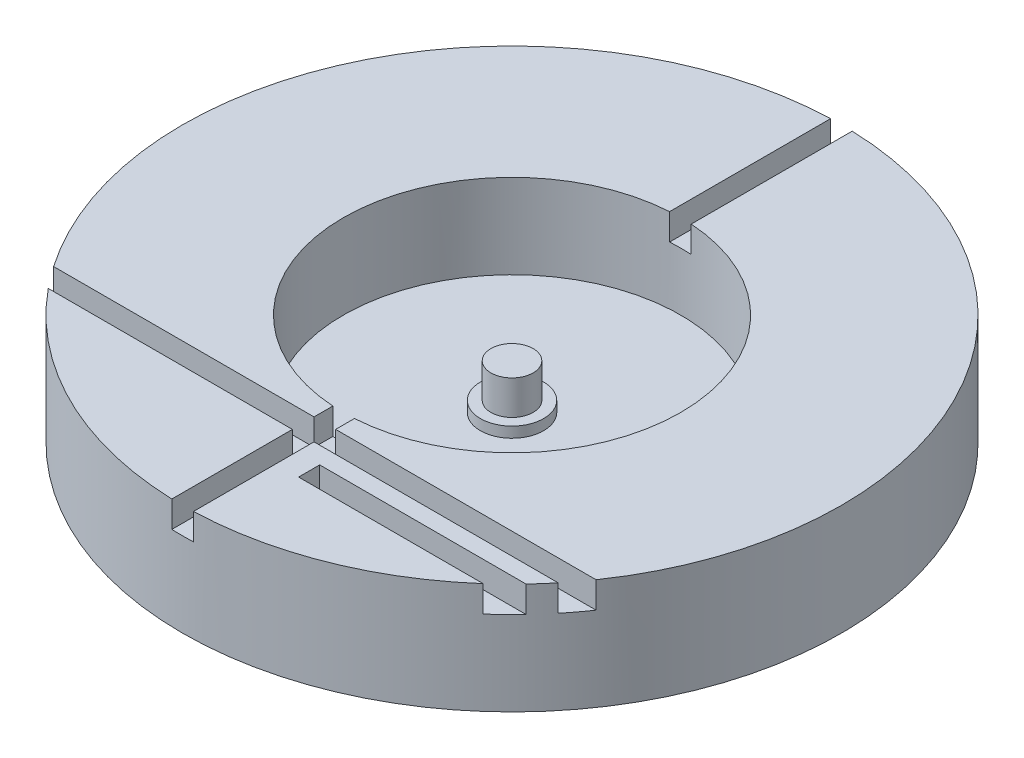
ISO-10303-21;
HEADER;
FILE_DESCRIPTION(('STEP AP214'),'2;1');
FILE_NAME('part.step','',(''),(''),'','','');
FILE_SCHEMA(('AUTOMOTIVE_DESIGN { 1 0 10303 214 1 1 1 1 }'));
ENDSEC;
DATA;
#1=APPLICATION_CONTEXT('core data for automotive mechanical design processes');
#2=APPLICATION_PROTOCOL_DEFINITION('international standard','automotive_design',2000,#1);
#3=PRODUCT_CONTEXT('',#1,'mechanical');
#4=PRODUCT('Part','Part','',(#3));
#5=PRODUCT_RELATED_PRODUCT_CATEGORY('part','',(#4));
#6=PRODUCT_DEFINITION_FORMATION('','',#4);
#7=PRODUCT_DEFINITION_CONTEXT('part definition',#1,'design');
#8=PRODUCT_DEFINITION('design','',#6,#7);
#9=PRODUCT_DEFINITION_SHAPE('','',#8);
#10=(LENGTH_UNIT() NAMED_UNIT(*) SI_UNIT(.MILLI.,.METRE.));
#11=(NAMED_UNIT(*) PLANE_ANGLE_UNIT() SI_UNIT($,.RADIAN.));
#12=(NAMED_UNIT(*) SI_UNIT($,.STERADIAN.) SOLID_ANGLE_UNIT());
#13=UNCERTAINTY_MEASURE_WITH_UNIT(LENGTH_MEASURE(1.E-05),#10,'distance_accuracy_value','');
#14=(GEOMETRIC_REPRESENTATION_CONTEXT(3) GLOBAL_UNCERTAINTY_ASSIGNED_CONTEXT((#13)) GLOBAL_UNIT_ASSIGNED_CONTEXT((#10,
#11,#12)) REPRESENTATION_CONTEXT('',''));
#15=CARTESIAN_POINT('',(0.,0.,0.));
#16=DIRECTION('',(0.,0.,1.));
#17=DIRECTION('',(1.,0.,0.));
#18=AXIS2_PLACEMENT_3D('',#15,#16,#17);
#19=CARTESIAN_POINT('',(0.,21.,0.));
#20=DIRECTION('',(0.,1.,0.));
#21=DIRECTION('',(0.,0.,1.));
#22=AXIS2_PLACEMENT_3D('',#19,#20,#21);
#23=PLANE('',#22);
#24=DIRECTION('',(1.,0.,0.));
#25=VECTOR('',#24,1.);
#26=CARTESIAN_POINT('',(0.,21.,46.8482798010705));
#27=LINE('',#26,#25);
#28=CARTESIAN_POINT('',(6.37014236959566,21.,46.8482798010705));
#29=VERTEX_POINT('',#28);
#30=CARTESIAN_POINT('',(41.3701423695956,21.,46.8482798010705));
#31=VERTEX_POINT('',#30);
#32=EDGE_CURVE('E387',#29,#31,#27,.T.);
#33=ORIENTED_EDGE('',*,*,#32,.F.);
#34=DIRECTION('',(0.,0.,1.));
#35=VECTOR('',#34,1.);
#36=CARTESIAN_POINT('',(6.37014236959566,21.,0.));
#37=LINE('',#36,#35);
#38=CARTESIAN_POINT('',(6.37014236959566,21.,42.8482798010705));
#39=VERTEX_POINT('',#38);
#40=EDGE_CURVE('E384',#39,#29,#37,.T.);
#41=ORIENTED_EDGE('',*,*,#40,.F.);
#42=DIRECTION('',(1.,0.,0.));
#43=VECTOR('',#42,1.);
#44=CARTESIAN_POINT('',(0.,21.,42.8482798010705));
#45=LINE('',#44,#43);
#46=CARTESIAN_POINT('',(45.5002738243318,21.,42.8482798010705));
#47=VERTEX_POINT('',#46);
#48=EDGE_CURVE('E373',#39,#47,#45,.T.);
#49=ORIENTED_EDGE('',*,*,#48,.T.);
#50=CARTESIAN_POINT('',(0.,21.,0.));
#51=DIRECTION('',(0.,1.,0.));
#52=DIRECTION('',(0.,0.,1.));
#53=AXIS2_PLACEMENT_3D('',#50,#51,#52);
#54=CIRCLE('',#53,62.5);
#55=CARTESIAN_POINT('',(48.35,21.,39.6046398796909));
#56=VERTEX_POINT('',#55);
#57=EDGE_CURVE('E189',#47,#56,#54,.T.);
#58=ORIENTED_EDGE('',*,*,#57,.T.);
#59=DIRECTION('',(1.,0.,0.));
#60=VECTOR('',#59,1.);
#61=CARTESIAN_POINT('',(-48.35,21.,39.6046398796909));
#62=LINE('',#61,#60);
#63=CARTESIAN_POINT('',(2.05000000000001,21.,39.6046398796909));
#64=VERTEX_POINT('',#63);
#65=EDGE_CURVE('E211',#64,#56,#62,.T.);
#66=ORIENTED_EDGE('',*,*,#65,.F.);
#67=DIRECTION('',(0.,0.,-1.));
#68=VECTOR('',#67,1.);
#69=CARTESIAN_POINT('',(2.05000000000001,21.,-62.4663709526974));
#70=LINE('',#69,#68);
#71=CARTESIAN_POINT('',(2.05000000000001,21.,62.4663709526974));
#72=VERTEX_POINT('',#71);
#73=EDGE_CURVE('E233',#72,#64,#70,.T.);
#74=ORIENTED_EDGE('',*,*,#73,.F.);
#75=EDGE_CURVE('E281',#72,#31,#54,.T.);
#76=ORIENTED_EDGE('',*,*,#75,.T.);
#77=EDGE_LOOP('',(#33,#41,#49,#58,#66,#74,#76));
#78=FACE_BOUND('',#77,.T.);
#79=ADVANCED_FACE('F32',(#78),#23,.T.);
#80=CARTESIAN_POINT('',(-48.35,21.,39.6046398796908));
#81=VERTEX_POINT('',#80);
#82=CARTESIAN_POINT('',(-2.04999999999999,21.,39.6046398796909));
#83=VERTEX_POINT('',#82);
#84=EDGE_CURVE('E201',#81,#83,#62,.T.);
#85=ORIENTED_EDGE('',*,*,#84,.F.);
#86=CARTESIAN_POINT('',(-2.05000000000002,21.,62.4663709526974));
#87=VERTEX_POINT('',#86);
#88=EDGE_CURVE('E288',#81,#87,#54,.T.);
#89=ORIENTED_EDGE('',*,*,#88,.T.);
#90=DIRECTION('',(0.,0.,1.));
#91=VECTOR('',#90,1.);
#92=CARTESIAN_POINT('',(-2.04999999999999,21.,-62.4663709526974));
#93=LINE('',#92,#91);
#94=EDGE_CURVE('E228',#83,#87,#93,.T.);
#95=ORIENTED_EDGE('',*,*,#94,.F.);
#96=EDGE_LOOP('',(#85,#89,#95));
#97=FACE_BOUND('',#96,.T.);
#98=ADVANCED_FACE('F374',(#97),#23,.T.);
#99=CARTESIAN_POINT('',(-2.04999999999999,16.,-62.4663709526974));
#100=DIRECTION('',(-1.,0.,0.));
#101=DIRECTION('',(0.,0.,1.));
#102=AXIS2_PLACEMENT_3D('',#99,#100,#101);
#103=PLANE('',#102);
#104=DIRECTION('',(0.,0.,1.));
#105=VECTOR('',#104,1.);
#106=CARTESIAN_POINT('',(-2.04999999999999,16.,-62.4663709526974));
#107=LINE('',#106,#105);
#108=CARTESIAN_POINT('',(-2.04999999999999,16.,39.6046398796909));
#109=VERTEX_POINT('',#108);
#110=CARTESIAN_POINT('',(-2.05000000000002,16.,62.4663709526974));
#111=VERTEX_POINT('',#110);
#112=EDGE_CURVE('E232',#109,#111,#107,.T.);
#113=ORIENTED_EDGE('',*,*,#112,.F.);
#114=DIRECTION('',(0.,1.,0.));
#115=VECTOR('',#114,1.);
#116=CARTESIAN_POINT('',(-2.04999999999999,16.,39.6046398796909));
#117=LINE('',#116,#115);
#118=EDGE_CURVE('E225',#109,#83,#117,.T.);
#119=ORIENTED_EDGE('',*,*,#118,.T.);
#120=ORIENTED_EDGE('',*,*,#94,.T.);
#121=DIRECTION('',(0.,1.,0.));
#122=VECTOR('',#121,1.);
#123=CARTESIAN_POINT('',(-2.05000000000002,16.,62.4663709526974));
#124=LINE('',#123,#122);
#125=EDGE_CURVE('E258',#111,#87,#124,.T.);
#126=ORIENTED_EDGE('',*,*,#125,.F.);
#127=EDGE_LOOP('',(#113,#119,#120,#126));
#128=FACE_BOUND('',#127,.T.);
#129=ADVANCED_FACE('F353',(#128),#103,.F.);
#130=CARTESIAN_POINT('',(2.05000000000001,16.,-62.4663709526974));
#131=DIRECTION('',(1.,0.,0.));
#132=DIRECTION('',(0.,0.,-1.));
#133=AXIS2_PLACEMENT_3D('',#130,#131,#132);
#134=PLANE('',#133);
#135=ORIENTED_EDGE('',*,*,#73,.T.);
#136=DIRECTION('',(0.,-1.,0.));
#137=VECTOR('',#136,1.);
#138=CARTESIAN_POINT('',(2.05000000000001,16.,39.6046398796909));
#139=LINE('',#138,#137);
#140=CARTESIAN_POINT('',(2.05000000000001,16.,39.6046398796909));
#141=VERTEX_POINT('',#140);
#142=EDGE_CURVE('E11',#64,#141,#139,.T.);
#143=ORIENTED_EDGE('',*,*,#142,.T.);
#144=DIRECTION('',(0.,0.,-1.));
#145=VECTOR('',#144,1.);
#146=CARTESIAN_POINT('',(2.05000000000001,16.,-62.4663709526974));
#147=LINE('',#146,#145);
#148=CARTESIAN_POINT('',(2.05000000000001,16.,62.4663709526974));
#149=VERTEX_POINT('',#148);
#150=EDGE_CURVE('E240',#149,#141,#147,.T.);
#151=ORIENTED_EDGE('',*,*,#150,.F.);
#152=DIRECTION('',(0.,1.,0.));
#153=VECTOR('',#152,1.);
#154=CARTESIAN_POINT('',(2.05000000000001,16.,62.4663709526974));
#155=LINE('',#154,#153);
#156=EDGE_CURVE('E256',#149,#72,#155,.T.);
#157=ORIENTED_EDGE('',*,*,#156,.T.);
#158=EDGE_LOOP('',(#135,#143,#151,#157));
#159=FACE_BOUND('',#158,.T.);
#160=ADVANCED_FACE('F363',(#159),#134,.F.);
#161=DIRECTION('',(-1.,0.,0.));
#162=VECTOR('',#161,1.);
#163=CARTESIAN_POINT('',(-51.4392845984468,21.,35.5));
#164=LINE('',#163,#162);
#165=CARTESIAN_POINT('',(51.4392845984468,21.,35.5));
#166=VERTEX_POINT('',#165);
#167=CARTESIAN_POINT('',(2.05000000000001,21.,35.5));
#168=VERTEX_POINT('',#167);
#169=EDGE_CURVE('E209',#166,#168,#164,.T.);
#170=ORIENTED_EDGE('',*,*,#169,.F.);
#171=CARTESIAN_POINT('',(2.05000000000001,21.,-62.4663709526974));
#172=VERTEX_POINT('',#171);
#173=EDGE_CURVE('E323',#166,#172,#54,.T.);
#174=ORIENTED_EDGE('',*,*,#173,.T.);
#175=CARTESIAN_POINT('',(2.05000000000001,21.,-31.9342684275059));
#176=VERTEX_POINT('',#175);
#177=EDGE_CURVE('E247',#176,#172,#70,.T.);
#178=ORIENTED_EDGE('',*,*,#177,.F.);
#179=CARTESIAN_POINT('',(0.,21.,0.));
#180=DIRECTION('',(0.,1.,0.));
#181=DIRECTION('',(0.,0.,1.));
#182=AXIS2_PLACEMENT_3D('',#179,#180,#181);
#183=CIRCLE('',#182,32.);
#184=CARTESIAN_POINT('',(2.05000000000001,21.,31.9342684275059));
#185=VERTEX_POINT('',#184);
#186=EDGE_CURVE('E278',#185,#176,#183,.T.);
#187=ORIENTED_EDGE('',*,*,#186,.F.);
#188=EDGE_CURVE('E251',#168,#185,#70,.T.);
#189=ORIENTED_EDGE('',*,*,#188,.F.);
#190=EDGE_LOOP('',(#170,#174,#178,#187,#189));
#191=FACE_BOUND('',#190,.T.);
#192=ADVANCED_FACE('F313',(#191),#23,.T.);
#193=CARTESIAN_POINT('',(0.,7.,0.));
#194=DIRECTION('',(0.,1.,0.));
#195=DIRECTION('',(0.,0.,1.));
#196=AXIS2_PLACEMENT_3D('',#193,#194,#195);
#197=CYLINDRICAL_SURFACE('',#196,4.);
#198=CARTESIAN_POINT('',(0.,7.,0.));
#199=DIRECTION('',(0.,1.,0.));
#200=DIRECTION('',(0.,0.,1.));
#201=AXIS2_PLACEMENT_3D('',#198,#199,#200);
#202=CIRCLE('',#201,4.);
#203=CARTESIAN_POINT('',(0.,7.,4.));
#204=VERTEX_POINT('',#203);
#205=EDGE_CURVE('E264',#204,#204,#202,.T.);
#206=CARTESIAN_POINT('',(0.,13.5,0.));
#207=DIRECTION('',(0.,1.,0.));
#208=DIRECTION('',(0.,0.,1.));
#209=AXIS2_PLACEMENT_3D('',#206,#207,#208);
#210=CIRCLE('',#209,4.);
#211=CARTESIAN_POINT('',(0.,13.5,4.));
#212=VERTEX_POINT('',#211);
#213=EDGE_CURVE('E255',#212,#212,#210,.T.);
#214=CARTESIAN_POINT('',(0.,7.,4.));
#215=CARTESIAN_POINT('',(0.,7.06770833333334,4.));
#216=CARTESIAN_POINT('',(0.,7.13541666666667,4.));
#217=CARTESIAN_POINT('',(0.,7.27083333333334,4.));
#218=CARTESIAN_POINT('',(0.,7.33854166666667,4.));
#219=CARTESIAN_POINT('',(0.,7.47395833333334,4.));
#220=CARTESIAN_POINT('',(0.,7.54166666666667,4.));
#221=CARTESIAN_POINT('',(0.,7.67708333333333,4.));
#222=CARTESIAN_POINT('',(0.,7.74479166666667,4.));
#223=CARTESIAN_POINT('',(0.,7.88020833333333,4.));
#224=CARTESIAN_POINT('',(0.,7.94791666666667,4.));
#225=CARTESIAN_POINT('',(0.,8.08333333333333,4.));
#226=CARTESIAN_POINT('',(0.,8.15104166666667,4.));
#227=CARTESIAN_POINT('',(0.,8.28645833333334,4.));
#228=CARTESIAN_POINT('',(0.,8.35416666666667,4.));
#229=CARTESIAN_POINT('',(0.,8.48958333333334,4.));
#230=CARTESIAN_POINT('',(0.,8.55729166666667,4.));
#231=CARTESIAN_POINT('',(0.,8.69270833333334,4.));
#232=CARTESIAN_POINT('',(0.,8.76041666666667,4.));
#233=CARTESIAN_POINT('',(0.,8.89583333333334,4.));
#234=CARTESIAN_POINT('',(0.,8.96354166666667,4.));
#235=CARTESIAN_POINT('',(0.,9.09895833333333,4.));
#236=CARTESIAN_POINT('',(0.,9.16666666666667,4.));
#237=CARTESIAN_POINT('',(0.,9.30208333333333,4.));
#238=CARTESIAN_POINT('',(0.,9.36979166666667,4.));
#239=CARTESIAN_POINT('',(0.,9.50520833333333,4.));
#240=CARTESIAN_POINT('',(0.,9.57291666666667,4.));
#241=CARTESIAN_POINT('',(0.,9.70833333333333,4.));
#242=CARTESIAN_POINT('',(0.,9.77604166666667,4.));
#243=CARTESIAN_POINT('',(0.,9.91145833333333,4.));
#244=CARTESIAN_POINT('',(0.,9.97916666666667,4.));
#245=CARTESIAN_POINT('',(0.,10.1145833333333,4.));
#246=CARTESIAN_POINT('',(0.,10.1822916666667,4.));
#247=CARTESIAN_POINT('',(0.,10.3177083333333,4.));
#248=CARTESIAN_POINT('',(0.,10.3854166666667,4.));
#249=CARTESIAN_POINT('',(0.,10.5208333333333,4.));
#250=CARTESIAN_POINT('',(0.,10.5885416666667,4.));
#251=CARTESIAN_POINT('',(0.,10.7239583333333,4.));
#252=CARTESIAN_POINT('',(0.,10.7916666666667,4.));
#253=CARTESIAN_POINT('',(0.,10.9270833333333,4.));
#254=CARTESIAN_POINT('',(0.,10.9947916666667,4.));
#255=CARTESIAN_POINT('',(0.,11.1302083333333,4.));
#256=CARTESIAN_POINT('',(0.,11.1979166666667,4.));
#257=CARTESIAN_POINT('',(0.,11.3333333333333,4.));
#258=CARTESIAN_POINT('',(0.,11.4010416666667,4.));
#259=CARTESIAN_POINT('',(0.,11.5364583333333,4.));
#260=CARTESIAN_POINT('',(0.,11.6041666666667,4.));
#261=CARTESIAN_POINT('',(0.,11.7395833333333,4.));
#262=CARTESIAN_POINT('',(0.,11.8072916666667,4.));
#263=CARTESIAN_POINT('',(0.,11.9427083333333,4.));
#264=CARTESIAN_POINT('',(0.,12.0104166666667,4.));
#265=CARTESIAN_POINT('',(0.,12.1458333333333,4.));
#266=CARTESIAN_POINT('',(0.,12.2135416666667,4.));
#267=CARTESIAN_POINT('',(0.,12.3489583333333,4.));
#268=CARTESIAN_POINT('',(0.,12.4166666666667,4.));
#269=CARTESIAN_POINT('',(0.,12.5520833333333,4.));
#270=CARTESIAN_POINT('',(0.,12.6197916666667,4.));
#271=CARTESIAN_POINT('',(0.,12.7552083333333,4.));
#272=CARTESIAN_POINT('',(0.,12.8229166666667,4.));
#273=CARTESIAN_POINT('',(0.,12.9583333333333,4.));
#274=CARTESIAN_POINT('',(0.,13.0260416666667,4.));
#275=CARTESIAN_POINT('',(0.,13.1614583333333,4.));
#276=CARTESIAN_POINT('',(0.,13.2291666666667,4.));
#277=CARTESIAN_POINT('',(0.,13.3645833333333,4.));
#278=CARTESIAN_POINT('',(0.,13.4322916666667,4.));
#279=CARTESIAN_POINT('',(0.,13.5,4.));
#280=B_SPLINE_CURVE_WITH_KNOTS('',3,(#214,#215,#216,#217,#218,#219,#220,#221,#222,#223,#224,
#225,#226,#227,#228,#229,#230,#231,#232,#233,#234,#235,#236,#237,#238,#239,#240,#241,#242,#243,
#244,#245,#246,#247,#248,#249,#250,#251,#252,#253,#254,#255,#256,#257,#258,#259,#260,#261,#262,
#263,#264,#265,#266,#267,#268,#269,#270,#271,#272,#273,#274,#275,#276,#277,#278,#279),
.UNSPECIFIED.,.F.,.F.,(4,2,2,2,2,2,2,2,2,2,2,2,2,2,2,2,2,2,2,2,2,2,2,2,2,2,2,2,2,2,2,2,4),(0.,
0.203124999999999,0.40625,0.609375,0.812499999999999,1.015625,1.21875,1.421875,1.625,1.828125,
2.03125,2.234375,2.4375,2.640625,2.84375,3.046875,3.25,3.453125,3.65625,3.859375,4.0625,
4.265625,4.46875,4.671875,4.875,5.078125,5.28125,5.484375,5.6875,5.890625,6.09375,6.296875,6.5),.UNSPECIFIED.);
#281=EDGE_CURVE('BSEAM421',#204,#212,#280,.T.);
#282=ORIENTED_EDGE('',*,*,#205,.T.);
#283=ORIENTED_EDGE('',*,*,#213,.F.);
#284=ORIENTED_EDGE('',*,*,#281,.T.);
#285=ORIENTED_EDGE('',*,*,#281,.F.);
#286=EDGE_LOOP('',(#282,#284,#283,#285));
#287=FACE_BOUND('',#286,.T.);
#288=ADVANCED_FACE('F421',(#287),#197,.T.);
#289=CARTESIAN_POINT('',(0.,5.,0.));
#290=DIRECTION('',(0.,1.,0.));
#291=DIRECTION('',(0.,0.,1.));
#292=AXIS2_PLACEMENT_3D('',#289,#290,#291);
#293=CYLINDRICAL_SURFACE('',#292,6.);
#294=CARTESIAN_POINT('',(0.,5.,0.));
#295=DIRECTION('',(0.,1.,0.));
#296=DIRECTION('',(0.,0.,1.));
#297=AXIS2_PLACEMENT_3D('',#294,#295,#296);
#298=CIRCLE('',#297,6.);
#299=CARTESIAN_POINT('',(0.,5.,6.));
#300=VERTEX_POINT('',#299);
#301=EDGE_CURVE('E270',#300,#300,#298,.T.);
#302=ORIENTED_EDGE('',*,*,#301,.T.);
#303=EDGE_LOOP('',(#302));
#304=FACE_BOUND('',#303,.T.);
#305=CARTESIAN_POINT('',(0.,7.,0.));
#306=DIRECTION('',(0.,1.,0.));
#307=DIRECTION('',(0.,0.,1.));
#308=AXIS2_PLACEMENT_3D('',#305,#306,#307);
#309=CIRCLE('',#308,6.);
#310=CARTESIAN_POINT('',(0.,7.,6.));
#311=VERTEX_POINT('',#310);
#312=EDGE_CURVE('E267',#311,#311,#309,.T.);
#313=ORIENTED_EDGE('',*,*,#312,.F.);
#314=EDGE_LOOP('',(#313));
#315=FACE_BOUND('',#314,.T.);
#316=ADVANCED_FACE('F420',(#304,#315),#293,.T.);
#317=CARTESIAN_POINT('',(0.,21.,0.));
#318=DIRECTION('',(0.,-1.,0.));
#319=DIRECTION('',(0.,0.,-1.));
#320=AXIS2_PLACEMENT_3D('',#317,#318,#319);
#321=CYLINDRICAL_SURFACE('',#320,62.5);
#322=CARTESIAN_POINT('',(0.,16.,0.));
#323=DIRECTION('',(0.,1.,0.));
#324=DIRECTION('',(0.,0.,1.));
#325=AXIS2_PLACEMENT_3D('',#322,#323,#324);
#326=CIRCLE('',#325,62.5);
#327=CARTESIAN_POINT('',(41.3701423695956,16.,46.8482798010705));
#328=VERTEX_POINT('',#327);
#329=CARTESIAN_POINT('',(45.5002738243318,16.,42.8482798010705));
#330=VERTEX_POINT('',#329);
#331=EDGE_CURVE('E179',#328,#330,#326,.T.);
#332=ORIENTED_EDGE('',*,*,#331,.F.);
#333=DIRECTION('',(0.,1.,0.));
#334=VECTOR('',#333,1.);
#335=CARTESIAN_POINT('',(41.3701423695956,16.,46.8482798010705));
#336=LINE('',#335,#334);
#337=EDGE_CURVE('E190',#328,#31,#336,.T.);
#338=ORIENTED_EDGE('',*,*,#337,.T.);
#339=ORIENTED_EDGE('',*,*,#75,.F.);
#340=ORIENTED_EDGE('',*,*,#156,.F.);
#341=CARTESIAN_POINT('',(0.,16.,0.));
#342=DIRECTION('',(0.,1.,0.));
#343=DIRECTION('',(0.,0.,1.));
#344=AXIS2_PLACEMENT_3D('',#341,#342,#343);
#345=CIRCLE('',#344,62.5);
#346=EDGE_CURVE('E236',#111,#149,#345,.T.);
#347=ORIENTED_EDGE('',*,*,#346,.F.);
#348=ORIENTED_EDGE('',*,*,#125,.T.);
#349=ORIENTED_EDGE('',*,*,#88,.F.);
#350=DIRECTION('',(0.,1.,0.));
#351=VECTOR('',#350,1.);
#352=CARTESIAN_POINT('',(-48.35,16.,39.6046398796908));
#353=LINE('',#352,#351);
#354=CARTESIAN_POINT('',(-48.35,16.,39.6046398796908));
#355=VERTEX_POINT('',#354);
#356=EDGE_CURVE('E217',#355,#81,#353,.T.);
#357=ORIENTED_EDGE('',*,*,#356,.F.);
#358=CARTESIAN_POINT('',(0.,16.,0.));
#359=DIRECTION('',(0.,1.,0.));
#360=DIRECTION('',(0.,0.,1.));
#361=AXIS2_PLACEMENT_3D('',#358,#359,#360);
#362=CIRCLE('',#361,62.5);
#363=CARTESIAN_POINT('',(-51.4392845984468,16.,35.5));
#364=VERTEX_POINT('',#363);
#365=EDGE_CURVE('E204',#364,#355,#362,.T.);
#366=ORIENTED_EDGE('',*,*,#365,.F.);
#367=DIRECTION('',(0.,1.,0.));
#368=VECTOR('',#367,1.);
#369=CARTESIAN_POINT('',(-51.4392845984468,16.,35.5));
#370=LINE('',#369,#368);
#371=CARTESIAN_POINT('',(-51.4392845984468,21.,35.5));
#372=VERTEX_POINT('',#371);
#373=EDGE_CURVE('E219',#364,#372,#370,.T.);
#374=ORIENTED_EDGE('',*,*,#373,.T.);
#375=CARTESIAN_POINT('',(-2.04999999999999,21.,-62.4663709526974));
#376=VERTEX_POINT('',#375);
#377=EDGE_CURVE('E285',#376,#372,#54,.T.);
#378=ORIENTED_EDGE('',*,*,#377,.F.);
#379=DIRECTION('',(0.,1.,0.));
#380=VECTOR('',#379,1.);
#381=CARTESIAN_POINT('',(-2.04999999999999,16.,-62.4663709526974));
#382=LINE('',#381,#380);
#383=CARTESIAN_POINT('',(-2.04999999999999,16.,-62.4663709526974));
#384=VERTEX_POINT('',#383);
#385=EDGE_CURVE('E243',#384,#376,#382,.T.);
#386=ORIENTED_EDGE('',*,*,#385,.F.);
#387=CARTESIAN_POINT('',(0.,16.,0.));
#388=DIRECTION('',(0.,1.,0.));
#389=DIRECTION('',(0.,0.,1.));
#390=AXIS2_PLACEMENT_3D('',#387,#388,#389);
#391=CIRCLE('',#390,62.5);
#392=CARTESIAN_POINT('',(2.05000000000001,16.,-62.4663709526974));
#393=VERTEX_POINT('',#392);
#394=EDGE_CURVE('E229',#393,#384,#391,.T.);
#395=ORIENTED_EDGE('',*,*,#394,.F.);
#396=DIRECTION('',(0.,1.,0.));
#397=VECTOR('',#396,1.);
#398=CARTESIAN_POINT('',(2.05000000000001,16.,-62.4663709526974));
#399=LINE('',#398,#397);
#400=EDGE_CURVE('E252',#393,#172,#399,.T.);
#401=ORIENTED_EDGE('',*,*,#400,.T.);
#402=ORIENTED_EDGE('',*,*,#173,.F.);
#403=DIRECTION('',(0.,1.,0.));
#404=VECTOR('',#403,1.);
#405=CARTESIAN_POINT('',(51.4392845984468,16.,35.5));
#406=LINE('',#405,#404);
#407=CARTESIAN_POINT('',(51.4392845984468,16.,35.5));
#408=VERTEX_POINT('',#407);
#409=EDGE_CURVE('E208',#408,#166,#406,.T.);
#410=ORIENTED_EDGE('',*,*,#409,.F.);
#411=CARTESIAN_POINT('',(0.,16.,0.));
#412=DIRECTION('',(0.,1.,0.));
#413=DIRECTION('',(0.,0.,1.));
#414=AXIS2_PLACEMENT_3D('',#411,#412,#413);
#415=CIRCLE('',#414,62.5);
#416=CARTESIAN_POINT('',(48.35,16.,39.6046398796909));
#417=VERTEX_POINT('',#416);
#418=EDGE_CURVE('E197',#417,#408,#415,.T.);
#419=ORIENTED_EDGE('',*,*,#418,.F.);
#420=DIRECTION('',(0.,1.,0.));
#421=VECTOR('',#420,1.);
#422=CARTESIAN_POINT('',(48.35,16.,39.6046398796909));
#423=LINE('',#422,#421);
#424=EDGE_CURVE('E214',#417,#56,#423,.T.);
#425=ORIENTED_EDGE('',*,*,#424,.T.);
#426=ORIENTED_EDGE('',*,*,#57,.F.);
#427=DIRECTION('',(0.,1.,0.));
#428=VECTOR('',#427,1.);
#429=CARTESIAN_POINT('',(45.5002738243318,16.,42.8482798010705));
#430=LINE('',#429,#428);
#431=EDGE_CURVE('E174',#330,#47,#430,.T.);
#432=ORIENTED_EDGE('',*,*,#431,.F.);
#433=EDGE_LOOP('',(#332,#338,#339,#340,#347,#348,#349,#357,#366,#374,#378,#386,#395,#401,#402,
#410,#419,#425,#426,#432));
#434=FACE_BOUND('',#433,.T.);
#435=CARTESIAN_POINT('',(0.,0.,0.));
#436=DIRECTION('',(0.,1.,0.));
#437=DIRECTION('',(0.,0.,1.));
#438=AXIS2_PLACEMENT_3D('',#435,#436,#437);
#439=CIRCLE('',#438,62.5);
#440=CARTESIAN_POINT('',(0.,0.,62.5));
#441=VERTEX_POINT('',#440);
#442=EDGE_CURVE('E277',#441,#441,#439,.T.);
#443=ORIENTED_EDGE('',*,*,#442,.T.);
#444=EDGE_LOOP('',(#443));
#445=FACE_BOUND('',#444,.T.);
#446=ADVANCED_FACE('F34',(#434,#445),#321,.T.);
#447=CARTESIAN_POINT('',(-2.04999999999999,21.,35.5));
#448=VERTEX_POINT('',#447);
#449=EDGE_CURVE('E212',#448,#372,#164,.T.);
#450=ORIENTED_EDGE('',*,*,#449,.F.);
#451=CARTESIAN_POINT('',(-2.04999999999999,21.,31.9342684275059));
#452=VERTEX_POINT('',#451);
#453=EDGE_CURVE('E248',#452,#448,#93,.T.);
#454=ORIENTED_EDGE('',*,*,#453,.F.);
#455=CARTESIAN_POINT('',(-2.04999999999999,21.,-31.9342684275059));
#456=VERTEX_POINT('',#455);
#457=EDGE_CURVE('E273',#456,#452,#183,.T.);
#458=ORIENTED_EDGE('',*,*,#457,.F.);
#459=EDGE_CURVE('E245',#376,#456,#93,.T.);
#460=ORIENTED_EDGE('',*,*,#459,.F.);
#461=ORIENTED_EDGE('',*,*,#377,.T.);
#462=EDGE_LOOP('',(#450,#454,#458,#460,#461));
#463=FACE_BOUND('',#462,.T.);
#464=ADVANCED_FACE('F345',(#463),#23,.T.);
#465=CARTESIAN_POINT('',(0.,0.,0.));
#466=DIRECTION('',(0.,1.,0.));
#467=DIRECTION('',(0.,0.,1.));
#468=AXIS2_PLACEMENT_3D('',#465,#466,#467);
#469=PLANE('',#468);
#470=ORIENTED_EDGE('',*,*,#442,.F.);
#471=EDGE_LOOP('',(#470));
#472=FACE_BOUND('',#471,.T.);
#473=ADVANCED_FACE('F413',(#472),#469,.F.);
#474=CARTESIAN_POINT('',(0.,5.,0.));
#475=DIRECTION('',(0.,1.,0.));
#476=DIRECTION('',(0.,0.,1.));
#477=AXIS2_PLACEMENT_3D('',#474,#475,#476);
#478=CYLINDRICAL_SURFACE('',#477,32.);
#479=ORIENTED_EDGE('',*,*,#186,.T.);
#480=DIRECTION('',(0.,1.,0.));
#481=VECTOR('',#480,1.);
#482=CARTESIAN_POINT('',(2.05000000000001,5.,-31.9342684275059));
#483=LINE('',#482,#481);
#484=CARTESIAN_POINT('',(2.05000000000001,16.,-31.9342684275059));
#485=VERTEX_POINT('',#484);
#486=EDGE_CURVE('E300',#176,#485,#483,.F.);
#487=ORIENTED_EDGE('',*,*,#486,.T.);
#488=CARTESIAN_POINT('',(0.,16.,0.));
#489=DIRECTION('',(0.,1.,0.));
#490=DIRECTION('',(0.,0.,1.));
#491=AXIS2_PLACEMENT_3D('',#488,#489,#490);
#492=CIRCLE('',#491,32.);
#493=CARTESIAN_POINT('',(-2.04999999999999,16.,-31.9342684275059));
#494=VERTEX_POINT('',#493);
#495=EDGE_CURVE('E291',#494,#485,#492,.F.);
#496=ORIENTED_EDGE('',*,*,#495,.F.);
#497=DIRECTION('',(0.,1.,0.));
#498=VECTOR('',#497,1.);
#499=CARTESIAN_POINT('',(-2.04999999999999,5.,-31.9342684275059));
#500=LINE('',#499,#498);
#501=EDGE_CURVE('E297',#494,#456,#500,.T.);
#502=ORIENTED_EDGE('',*,*,#501,.T.);
#503=ORIENTED_EDGE('',*,*,#457,.T.);
#504=DIRECTION('',(0.,1.,0.));
#505=VECTOR('',#504,1.);
#506=CARTESIAN_POINT('',(-2.04999999999999,5.,31.9342684275059));
#507=LINE('',#506,#505);
#508=CARTESIAN_POINT('',(-2.04999999999999,16.,31.9342684275059));
#509=VERTEX_POINT('',#508);
#510=EDGE_CURVE('E290',#452,#509,#507,.F.);
#511=ORIENTED_EDGE('',*,*,#510,.T.);
#512=CARTESIAN_POINT('',(2.05000000000001,16.,31.9342684275059));
#513=VERTEX_POINT('',#512);
#514=EDGE_CURVE('E284',#513,#509,#492,.F.);
#515=ORIENTED_EDGE('',*,*,#514,.F.);
#516=DIRECTION('',(0.,1.,0.));
#517=VECTOR('',#516,1.);
#518=CARTESIAN_POINT('',(2.05000000000001,5.,31.9342684275059));
#519=LINE('',#518,#517);
#520=EDGE_CURVE('E294',#513,#185,#519,.T.);
#521=ORIENTED_EDGE('',*,*,#520,.T.);
#522=EDGE_LOOP('',(#479,#487,#496,#502,#503,#511,#515,#521));
#523=FACE_BOUND('',#522,.T.);
#524=CARTESIAN_POINT('',(0.,5.,0.));
#525=DIRECTION('',(0.,1.,0.));
#526=DIRECTION('',(0.,0.,1.));
#527=AXIS2_PLACEMENT_3D('',#524,#525,#526);
#528=CIRCLE('',#527,32.);
#529=CARTESIAN_POINT('',(0.,5.,32.));
#530=VERTEX_POINT('',#529);
#531=EDGE_CURVE('E274',#530,#530,#528,.T.);
#532=ORIENTED_EDGE('',*,*,#531,.F.);
#533=EDGE_LOOP('',(#532));
#534=FACE_BOUND('',#533,.T.);
#535=ADVANCED_FACE('F335',(#523,#534),#478,.F.);
#536=CARTESIAN_POINT('',(0.,5.,0.));
#537=DIRECTION('',(0.,1.,0.));
#538=DIRECTION('',(0.,0.,1.));
#539=AXIS2_PLACEMENT_3D('',#536,#537,#538);
#540=PLANE('',#539);
#541=ORIENTED_EDGE('',*,*,#301,.F.);
#542=EDGE_LOOP('',(#541));
#543=FACE_BOUND('',#542,.T.);
#544=ORIENTED_EDGE('',*,*,#531,.T.);
#545=EDGE_LOOP('',(#544));
#546=FACE_BOUND('',#545,.T.);
#547=ADVANCED_FACE('F511',(#543,#546),#540,.T.);
#548=CARTESIAN_POINT('',(0.,7.,0.));
#549=DIRECTION('',(0.,1.,0.));
#550=DIRECTION('',(0.,0.,1.));
#551=AXIS2_PLACEMENT_3D('',#548,#549,#550);
#552=PLANE('',#551);
#553=ORIENTED_EDGE('',*,*,#205,.F.);
#554=EDGE_LOOP('',(#553));
#555=FACE_BOUND('',#554,.T.);
#556=ORIENTED_EDGE('',*,*,#312,.T.);
#557=EDGE_LOOP('',(#556));
#558=FACE_BOUND('',#557,.T.);
#559=ADVANCED_FACE('F452',(#555,#558),#552,.T.);
#560=CARTESIAN_POINT('',(0.,13.5,0.));
#561=DIRECTION('',(0.,1.,0.));
#562=DIRECTION('',(0.,0.,1.));
#563=AXIS2_PLACEMENT_3D('',#560,#561,#562);
#564=PLANE('',#563);
#565=ORIENTED_EDGE('',*,*,#213,.T.);
#566=EDGE_LOOP('',(#565));
#567=FACE_BOUND('',#566,.T.);
#568=ADVANCED_FACE('F449',(#567),#564,.T.);
#569=CARTESIAN_POINT('',(0.,16.,0.));
#570=DIRECTION('',(0.,1.,0.));
#571=DIRECTION('',(0.,0.,1.));
#572=AXIS2_PLACEMENT_3D('',#569,#570,#571);
#573=PLANE('',#572);
#574=CARTESIAN_POINT('',(-2.04999999999999,16.,35.5));
#575=VERTEX_POINT('',#574);
#576=EDGE_CURVE('E237',#509,#575,#107,.T.);
#577=ORIENTED_EDGE('',*,*,#576,.T.);
#578=DIRECTION('',(-1.,0.,0.));
#579=VECTOR('',#578,1.);
#580=CARTESIAN_POINT('',(-51.4392845984468,16.,35.5));
#581=LINE('',#580,#579);
#582=EDGE_CURVE('E200',#575,#364,#581,.T.);
#583=ORIENTED_EDGE('',*,*,#582,.T.);
#584=ORIENTED_EDGE('',*,*,#365,.T.);
#585=DIRECTION('',(1.,0.,0.));
#586=VECTOR('',#585,1.);
#587=CARTESIAN_POINT('',(-48.35,16.,39.6046398796909));
#588=LINE('',#587,#586);
#589=EDGE_CURVE('E55',#355,#109,#588,.T.);
#590=ORIENTED_EDGE('',*,*,#589,.T.);
#591=ORIENTED_EDGE('',*,*,#112,.T.);
#592=ORIENTED_EDGE('',*,*,#346,.T.);
#593=ORIENTED_EDGE('',*,*,#150,.T.);
#594=EDGE_CURVE('E206',#141,#417,#588,.T.);
#595=ORIENTED_EDGE('',*,*,#594,.T.);
#596=ORIENTED_EDGE('',*,*,#418,.T.);
#597=CARTESIAN_POINT('',(2.05000000000001,16.,35.5));
#598=VERTEX_POINT('',#597);
#599=EDGE_CURVE('E202',#408,#598,#581,.T.);
#600=ORIENTED_EDGE('',*,*,#599,.T.);
#601=EDGE_CURVE('E244',#598,#513,#147,.T.);
#602=ORIENTED_EDGE('',*,*,#601,.T.);
#603=ORIENTED_EDGE('',*,*,#514,.T.);
#604=EDGE_LOOP('',(#577,#583,#584,#590,#591,#592,#593,#595,#596,#600,#602,#603));
#605=FACE_BOUND('',#604,.T.);
#606=ADVANCED_FACE('F331',(#605),#573,.T.);
#607=ORIENTED_EDGE('',*,*,#453,.T.);
#608=DIRECTION('',(0.,-1.,0.));
#609=VECTOR('',#608,1.);
#610=CARTESIAN_POINT('',(-2.04999999999999,16.,35.5));
#611=LINE('',#610,#609);
#612=EDGE_CURVE('E216',#448,#575,#611,.T.);
#613=ORIENTED_EDGE('',*,*,#612,.T.);
#614=ORIENTED_EDGE('',*,*,#576,.F.);
#615=ORIENTED_EDGE('',*,*,#510,.F.);
#616=EDGE_LOOP('',(#607,#613,#614,#615));
#617=FACE_BOUND('',#616,.T.);
#618=ADVANCED_FACE('F342',(#617),#103,.F.);
#619=ORIENTED_EDGE('',*,*,#601,.F.);
#620=DIRECTION('',(0.,1.,0.));
#621=VECTOR('',#620,1.);
#622=CARTESIAN_POINT('',(2.05000000000001,16.,35.5));
#623=LINE('',#622,#621);
#624=EDGE_CURVE('E40',#598,#168,#623,.T.);
#625=ORIENTED_EDGE('',*,*,#624,.T.);
#626=ORIENTED_EDGE('',*,*,#188,.T.);
#627=ORIENTED_EDGE('',*,*,#520,.F.);
#628=EDGE_LOOP('',(#619,#625,#626,#627));
#629=FACE_BOUND('',#628,.T.);
#630=ADVANCED_FACE('F307',(#629),#134,.F.);
#631=ORIENTED_EDGE('',*,*,#177,.T.);
#632=ORIENTED_EDGE('',*,*,#400,.F.);
#633=EDGE_CURVE('E239',#485,#393,#147,.T.);
#634=ORIENTED_EDGE('',*,*,#633,.F.);
#635=ORIENTED_EDGE('',*,*,#486,.F.);
#636=EDGE_LOOP('',(#631,#632,#634,#635));
#637=FACE_BOUND('',#636,.T.);
#638=ADVANCED_FACE('F319',(#637),#134,.F.);
#639=EDGE_CURVE('E234',#384,#494,#107,.T.);
#640=ORIENTED_EDGE('',*,*,#639,.F.);
#641=ORIENTED_EDGE('',*,*,#385,.T.);
#642=ORIENTED_EDGE('',*,*,#459,.T.);
#643=ORIENTED_EDGE('',*,*,#501,.F.);
#644=EDGE_LOOP('',(#640,#641,#642,#643));
#645=FACE_BOUND('',#644,.T.);
#646=ADVANCED_FACE('F434',(#645),#103,.F.);
#647=ORIENTED_EDGE('',*,*,#495,.T.);
#648=ORIENTED_EDGE('',*,*,#633,.T.);
#649=ORIENTED_EDGE('',*,*,#394,.T.);
#650=ORIENTED_EDGE('',*,*,#639,.T.);
#651=EDGE_LOOP('',(#647,#648,#649,#650));
#652=FACE_BOUND('',#651,.T.);
#653=ADVANCED_FACE('F327',(#652),#573,.T.);
#654=CARTESIAN_POINT('',(-51.4392845984468,16.,35.5));
#655=DIRECTION('',(0.,0.,-1.));
#656=DIRECTION('',(-1.,0.,0.));
#657=AXIS2_PLACEMENT_3D('',#654,#655,#656);
#658=PLANE('',#657);
#659=ORIENTED_EDGE('',*,*,#599,.F.);
#660=ORIENTED_EDGE('',*,*,#409,.T.);
#661=ORIENTED_EDGE('',*,*,#169,.T.);
#662=ORIENTED_EDGE('',*,*,#624,.F.);
#663=EDGE_LOOP('',(#659,#660,#661,#662));
#664=FACE_BOUND('',#663,.T.);
#665=ADVANCED_FACE('F401',(#664),#658,.F.);
#666=CARTESIAN_POINT('',(-48.35,16.,39.6046398796909));
#667=DIRECTION('',(0.,0.,1.));
#668=DIRECTION('',(1.,0.,0.));
#669=AXIS2_PLACEMENT_3D('',#666,#667,#668);
#670=PLANE('',#669);
#671=ORIENTED_EDGE('',*,*,#65,.T.);
#672=ORIENTED_EDGE('',*,*,#424,.F.);
#673=ORIENTED_EDGE('',*,*,#594,.F.);
#674=ORIENTED_EDGE('',*,*,#142,.F.);
#675=EDGE_LOOP('',(#671,#672,#673,#674));
#676=FACE_BOUND('',#675,.T.);
#677=ADVANCED_FACE('F368',(#676),#670,.F.);
#678=ORIENTED_EDGE('',*,*,#589,.F.);
#679=ORIENTED_EDGE('',*,*,#356,.T.);
#680=ORIENTED_EDGE('',*,*,#84,.T.);
#681=ORIENTED_EDGE('',*,*,#118,.F.);
#682=EDGE_LOOP('',(#678,#679,#680,#681));
#683=FACE_BOUND('',#682,.T.);
#684=ADVANCED_FACE('F376',(#683),#670,.F.);
#685=ORIENTED_EDGE('',*,*,#449,.T.);
#686=ORIENTED_EDGE('',*,*,#373,.F.);
#687=ORIENTED_EDGE('',*,*,#582,.F.);
#688=ORIENTED_EDGE('',*,*,#612,.F.);
#689=EDGE_LOOP('',(#685,#686,#687,#688));
#690=FACE_BOUND('',#689,.T.);
#691=ADVANCED_FACE('F380',(#690),#658,.F.);
#692=CARTESIAN_POINT('',(0.,16.,46.8482798010705));
#693=DIRECTION('',(0.,0.,1.));
#694=DIRECTION('',(1.,0.,0.));
#695=AXIS2_PLACEMENT_3D('',#692,#693,#694);
#696=PLANE('',#695);
#697=ORIENTED_EDGE('',*,*,#32,.T.);
#698=ORIENTED_EDGE('',*,*,#337,.F.);
#699=DIRECTION('',(1.,0.,0.));
#700=VECTOR('',#699,1.);
#701=CARTESIAN_POINT('',(0.,16.,46.8482798010705));
#702=LINE('',#701,#700);
#703=CARTESIAN_POINT('',(6.37014236959566,16.,46.8482798010705));
#704=VERTEX_POINT('',#703);
#705=EDGE_CURVE('E47',#704,#328,#702,.T.);
#706=ORIENTED_EDGE('',*,*,#705,.F.);
#707=DIRECTION('',(0.,1.,0.));
#708=VECTOR('',#707,1.);
#709=CARTESIAN_POINT('',(6.37014236959566,16.,46.8482798010705));
#710=LINE('',#709,#708);
#711=EDGE_CURVE('E192',#704,#29,#710,.T.);
#712=ORIENTED_EDGE('',*,*,#711,.T.);
#713=EDGE_LOOP('',(#697,#698,#706,#712));
#714=FACE_BOUND('',#713,.T.);
#715=ADVANCED_FACE('F392',(#714),#696,.F.);
#716=CARTESIAN_POINT('',(6.37014236959566,16.,0.));
#717=DIRECTION('',(-1.,0.,0.));
#718=DIRECTION('',(0.,0.,1.));
#719=AXIS2_PLACEMENT_3D('',#716,#717,#718);
#720=PLANE('',#719);
#721=ORIENTED_EDGE('',*,*,#40,.T.);
#722=ORIENTED_EDGE('',*,*,#711,.F.);
#723=DIRECTION('',(0.,0.,1.));
#724=VECTOR('',#723,1.);
#725=CARTESIAN_POINT('',(6.37014236959566,16.,0.));
#726=LINE('',#725,#724);
#727=CARTESIAN_POINT('',(6.37014236959566,16.,42.8482798010705));
#728=VERTEX_POINT('',#727);
#729=EDGE_CURVE('E178',#728,#704,#726,.T.);
#730=ORIENTED_EDGE('',*,*,#729,.F.);
#731=DIRECTION('',(0.,1.,0.));
#732=VECTOR('',#731,1.);
#733=CARTESIAN_POINT('',(6.37014236959566,16.,42.8482798010705));
#734=LINE('',#733,#732);
#735=EDGE_CURVE('E176',#728,#39,#734,.T.);
#736=ORIENTED_EDGE('',*,*,#735,.T.);
#737=EDGE_LOOP('',(#721,#722,#730,#736));
#738=FACE_BOUND('',#737,.T.);
#739=ADVANCED_FACE('F391',(#738),#720,.F.);
#740=CARTESIAN_POINT('',(0.,16.,42.8482798010705));
#741=DIRECTION('',(0.,0.,1.));
#742=DIRECTION('',(1.,0.,0.));
#743=AXIS2_PLACEMENT_3D('',#740,#741,#742);
#744=PLANE('',#743);
#745=ORIENTED_EDGE('',*,*,#48,.F.);
#746=ORIENTED_EDGE('',*,*,#735,.F.);
#747=DIRECTION('',(1.,0.,0.));
#748=VECTOR('',#747,1.);
#749=CARTESIAN_POINT('',(0.,16.,42.8482798010705));
#750=LINE('',#749,#748);
#751=EDGE_CURVE('E170',#728,#330,#750,.T.);
#752=ORIENTED_EDGE('',*,*,#751,.T.);
#753=ORIENTED_EDGE('',*,*,#431,.T.);
#754=EDGE_LOOP('',(#745,#746,#752,#753));
#755=FACE_BOUND('',#754,.T.);
#756=ADVANCED_FACE('F172',(#755),#744,.T.);
#757=CARTESIAN_POINT('',(0.,16.,0.));
#758=DIRECTION('',(0.,1.,0.));
#759=DIRECTION('',(0.,0.,1.));
#760=AXIS2_PLACEMENT_3D('',#757,#758,#759);
#761=PLANE('',#760);
#762=ORIENTED_EDGE('',*,*,#705,.T.);
#763=ORIENTED_EDGE('',*,*,#331,.T.);
#764=ORIENTED_EDGE('',*,*,#751,.F.);
#765=ORIENTED_EDGE('',*,*,#729,.T.);
#766=EDGE_LOOP('',(#762,#763,#764,#765));
#767=FACE_BOUND('',#766,.T.);
#768=ADVANCED_FACE('F182',(#767),#761,.T.);
#769=CLOSED_SHELL('',(#79,#98,#129,#160,#192,#288,#316,#446,#464,#473,#535,#547,#559,#568,#606,
#618,#630,#638,#646,#653,#665,#677,#684,#691,#715,#739,#756,#768));
#770=MANIFOLD_SOLID_BREP('B2',#769);
#771=ADVANCED_BREP_SHAPE_REPRESENTATION('',(#18,#770),#14);
#772=SHAPE_DEFINITION_REPRESENTATION(#9,#771);
ENDSEC;
END-ISO-10303-21;
